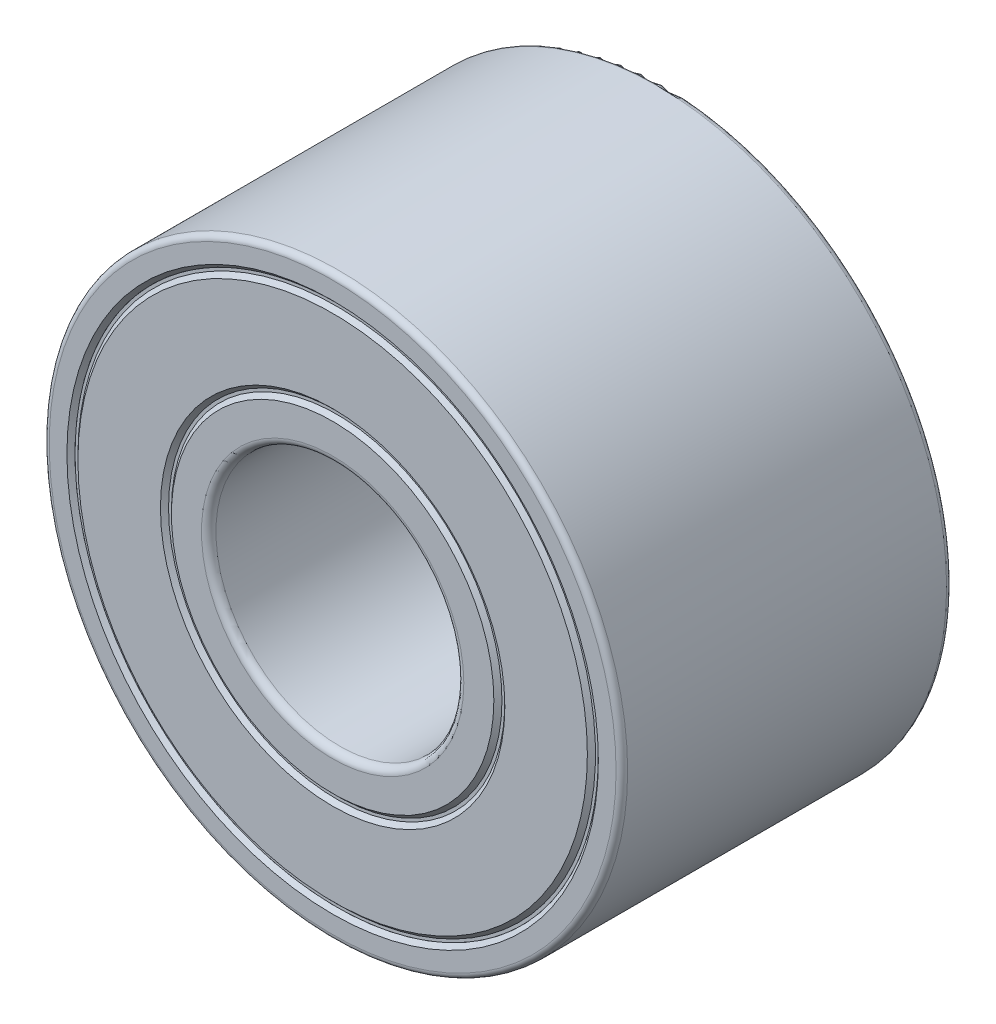
ISO-10303-21;
HEADER;
FILE_DESCRIPTION(('STEP AP214'),'2;1');
FILE_NAME('part.step','',(''),(''),'','','');
FILE_SCHEMA(('AUTOMOTIVE_DESIGN { 1 0 10303 214 1 1 1 1 }'));
ENDSEC;
DATA;
#1=APPLICATION_CONTEXT('core data for automotive mechanical design processes');
#2=APPLICATION_PROTOCOL_DEFINITION('international standard','automotive_design',2000,#1);
#3=PRODUCT_CONTEXT('',#1,'mechanical');
#4=PRODUCT('Part','Part','',(#3));
#5=PRODUCT_RELATED_PRODUCT_CATEGORY('part','',(#4));
#6=PRODUCT_DEFINITION_FORMATION('','',#4);
#7=PRODUCT_DEFINITION_CONTEXT('part definition',#1,'design');
#8=PRODUCT_DEFINITION('design','',#6,#7);
#9=PRODUCT_DEFINITION_SHAPE('','',#8);
#10=(LENGTH_UNIT() NAMED_UNIT(*) SI_UNIT(.MILLI.,.METRE.));
#11=(NAMED_UNIT(*) PLANE_ANGLE_UNIT() SI_UNIT($,.RADIAN.));
#12=(NAMED_UNIT(*) SI_UNIT($,.STERADIAN.) SOLID_ANGLE_UNIT());
#13=UNCERTAINTY_MEASURE_WITH_UNIT(LENGTH_MEASURE(1.E-05),#10,'distance_accuracy_value','');
#14=(GEOMETRIC_REPRESENTATION_CONTEXT(3) GLOBAL_UNCERTAINTY_ASSIGNED_CONTEXT((#13)) GLOBAL_UNIT_ASSIGNED_CONTEXT((#10,
#11,#12)) REPRESENTATION_CONTEXT('',''));
#15=CARTESIAN_POINT('',(0.,0.,0.));
#16=DIRECTION('',(0.,0.,1.));
#17=DIRECTION('',(1.,0.,0.));
#18=AXIS2_PLACEMENT_3D('',#15,#16,#17);
#19=CARTESIAN_POINT('',(0.,0.,-1.951));
#20=DIRECTION('',(0.,0.,-1.));
#21=DIRECTION('',(1.,0.,0.));
#22=AXIS2_PLACEMENT_3D('',#19,#20,#21);
#23=CYLINDRICAL_SURFACE('',#22,2.);
#24=CARTESIAN_POINT('',(0.,0.,-1.951));
#25=DIRECTION('',(0.,0.,-1.));
#26=DIRECTION('',(-1.,0.,0.));
#27=AXIS2_PLACEMENT_3D('',#24,#25,#26);
#28=CIRCLE('',#27,2.);
#29=CARTESIAN_POINT('',(-2.,0.,-1.951));
#30=VERTEX_POINT('',#29);
#31=EDGE_CURVE('E84',#30,#30,#28,.T.);
#32=ORIENTED_EDGE('',*,*,#31,.T.);
#33=EDGE_LOOP('',(#32));
#34=FACE_BOUND('',#33,.T.);
#35=CARTESIAN_POINT('',(0.,0.,-1.824));
#36=DIRECTION('',(0.,0.,-1.));
#37=DIRECTION('',(-1.,0.,0.));
#38=AXIS2_PLACEMENT_3D('',#35,#36,#37);
#39=CIRCLE('',#38,2.);
#40=CARTESIAN_POINT('',(-2.,0.,-1.824));
#41=VERTEX_POINT('',#40);
#42=EDGE_CURVE('E53',#41,#41,#39,.T.);
#43=ORIENTED_EDGE('',*,*,#42,.F.);
#44=EDGE_LOOP('',(#43));
#45=FACE_BOUND('',#44,.T.);
#46=ADVANCED_FACE('F50',(#34,#45),#23,.F.);
#47=CARTESIAN_POINT('',(0.,0.,-1.951));
#48=DIRECTION('',(0.,0.,-1.));
#49=DIRECTION('',(1.,0.,0.));
#50=AXIS2_PLACEMENT_3D('',#47,#48,#49);
#51=CYLINDRICAL_SURFACE('',#50,3.16666666666667);
#52=CARTESIAN_POINT('',(0.,0.,-1.951));
#53=DIRECTION('',(0.,0.,-1.));
#54=DIRECTION('',(-1.,0.,0.));
#55=AXIS2_PLACEMENT_3D('',#52,#53,#54);
#56=CIRCLE('',#55,3.16666666666667);
#57=CARTESIAN_POINT('',(-3.16666666666667,0.,-1.951));
#58=VERTEX_POINT('',#57);
#59=EDGE_CURVE('E11',#58,#58,#56,.T.);
#60=ORIENTED_EDGE('',*,*,#59,.F.);
#61=EDGE_LOOP('',(#60));
#62=FACE_BOUND('',#61,.T.);
#63=CARTESIAN_POINT('',(0.,0.,-1.824));
#64=DIRECTION('',(0.,0.,-1.));
#65=DIRECTION('',(-1.,0.,0.));
#66=AXIS2_PLACEMENT_3D('',#63,#64,#65);
#67=CIRCLE('',#66,3.16666666666667);
#68=CARTESIAN_POINT('',(-3.16666666666667,0.,-1.824));
#69=VERTEX_POINT('',#68);
#70=EDGE_CURVE('E70',#69,#69,#67,.T.);
#71=ORIENTED_EDGE('',*,*,#70,.T.);
#72=EDGE_LOOP('',(#71));
#73=FACE_BOUND('',#72,.T.);
#74=ADVANCED_FACE('F107',(#62,#73),#51,.T.);
#75=CARTESIAN_POINT('',(0.,-3.13166666666667,-1.951));
#76=DIRECTION('',(0.,0.,-1.));
#77=DIRECTION('',(1.,0.,0.));
#78=AXIS2_PLACEMENT_3D('',#75,#76,#77);
#79=PLANE('',#78);
#80=CARTESIAN_POINT('',(0.,0.,-1.951));
#81=DIRECTION('',(0.,0.,-1.));
#82=DIRECTION('',(-1.,0.,0.));
#83=AXIS2_PLACEMENT_3D('',#80,#81,#82);
#84=CIRCLE('',#83,3.13166666666667);
#85=CARTESIAN_POINT('',(-3.13166666666667,0.,-1.951));
#86=VERTEX_POINT('',#85);
#87=EDGE_CURVE('E57',#86,#86,#84,.T.);
#88=ORIENTED_EDGE('',*,*,#87,.F.);
#89=EDGE_LOOP('',(#88));
#90=FACE_BOUND('',#89,.T.);
#91=ORIENTED_EDGE('',*,*,#59,.T.);
#92=EDGE_LOOP('',(#91));
#93=FACE_BOUND('',#92,.T.);
#94=ADVANCED_FACE('F102',(#90,#93),#79,.T.);
#95=CARTESIAN_POINT('',(0.,0.,-1.951));
#96=DIRECTION('',(0.,0.,1.));
#97=DIRECTION('',(-1.,0.,0.));
#98=AXIS2_PLACEMENT_3D('',#95,#96,#97);
#99=CONICAL_SURFACE('',#98,3.13166666666667,0.785398163397448);
#100=CARTESIAN_POINT('',(0.,0.,-2.));
#101=DIRECTION('',(0.,0.,-1.));
#102=DIRECTION('',(-1.,0.,0.));
#103=AXIS2_PLACEMENT_3D('',#100,#101,#102);
#104=CIRCLE('',#103,3.08266666666667);
#105=CARTESIAN_POINT('',(-3.08266666666667,0.,-2.));
#106=VERTEX_POINT('',#105);
#107=EDGE_CURVE('E62',#106,#106,#104,.T.);
#108=ORIENTED_EDGE('',*,*,#107,.F.);
#109=EDGE_LOOP('',(#108));
#110=FACE_BOUND('',#109,.T.);
#111=ORIENTED_EDGE('',*,*,#87,.T.);
#112=EDGE_LOOP('',(#111));
#113=FACE_BOUND('',#112,.T.);
#114=ADVANCED_FACE('F99',(#110,#113),#99,.T.);
#115=CARTESIAN_POINT('',(0.,-2.084,-2.));
#116=DIRECTION('',(0.,0.,-1.));
#117=DIRECTION('',(1.,0.,0.));
#118=AXIS2_PLACEMENT_3D('',#115,#116,#117);
#119=PLANE('',#118);
#120=CARTESIAN_POINT('',(0.,0.,-2.));
#121=DIRECTION('',(0.,0.,-1.));
#122=DIRECTION('',(-1.,0.,0.));
#123=AXIS2_PLACEMENT_3D('',#120,#121,#122);
#124=CIRCLE('',#123,2.084);
#125=CARTESIAN_POINT('',(-2.084,0.,-2.));
#126=VERTEX_POINT('',#125);
#127=EDGE_CURVE('E89',#126,#126,#124,.T.);
#128=ORIENTED_EDGE('',*,*,#127,.F.);
#129=EDGE_LOOP('',(#128));
#130=FACE_BOUND('',#129,.T.);
#131=ORIENTED_EDGE('',*,*,#107,.T.);
#132=EDGE_LOOP('',(#131));
#133=FACE_BOUND('',#132,.T.);
#134=ADVANCED_FACE('F97',(#130,#133),#119,.T.);
#135=CARTESIAN_POINT('',(0.,0.,-2.));
#136=DIRECTION('',(0.,0.,-1.));
#137=DIRECTION('',(1.,0.,0.));
#138=AXIS2_PLACEMENT_3D('',#135,#136,#137);
#139=CONICAL_SURFACE('',#138,2.084,0.785398163397457);
#140=CARTESIAN_POINT('',(0.,0.,-1.951));
#141=DIRECTION('',(0.,0.,-1.));
#142=DIRECTION('',(-1.,0.,0.));
#143=AXIS2_PLACEMENT_3D('',#140,#141,#142);
#144=CIRCLE('',#143,2.035);
#145=CARTESIAN_POINT('',(-2.035,0.,-1.951));
#146=VERTEX_POINT('',#145);
#147=EDGE_CURVE('E80',#146,#146,#144,.T.);
#148=ORIENTED_EDGE('',*,*,#147,.F.);
#149=EDGE_LOOP('',(#148));
#150=FACE_BOUND('',#149,.T.);
#151=ORIENTED_EDGE('',*,*,#127,.T.);
#152=EDGE_LOOP('',(#151));
#153=FACE_BOUND('',#152,.T.);
#154=ADVANCED_FACE('F154',(#150,#153),#139,.F.);
#155=CARTESIAN_POINT('',(0.,-2.035,-1.951));
#156=DIRECTION('',(0.,0.,-1.));
#157=DIRECTION('',(1.,0.,0.));
#158=AXIS2_PLACEMENT_3D('',#155,#156,#157);
#159=PLANE('',#158);
#160=ORIENTED_EDGE('',*,*,#31,.F.);
#161=EDGE_LOOP('',(#160));
#162=FACE_BOUND('',#161,.T.);
#163=ORIENTED_EDGE('',*,*,#147,.T.);
#164=EDGE_LOOP('',(#163));
#165=FACE_BOUND('',#164,.T.);
#166=ADVANCED_FACE('F150',(#162,#165),#159,.T.);
#167=CARTESIAN_POINT('',(0.,-3.13166666666667,-1.824));
#168=DIRECTION('',(0.,0.,-1.));
#169=DIRECTION('',(1.,0.,0.));
#170=AXIS2_PLACEMENT_3D('',#167,#168,#169);
#171=PLANE('',#170);
#172=CARTESIAN_POINT('',(0.,0.,-1.824));
#173=DIRECTION('',(0.,0.,1.));
#174=DIRECTION('',(1.,0.,0.));
#175=AXIS2_PLACEMENT_3D('',#172,#173,#174);
#176=CIRCLE('',#175,3.07906154424528);
#177=CARTESIAN_POINT('',(3.07906154424528,0.,-1.824));
#178=VERTEX_POINT('',#177);
#179=EDGE_CURVE('E67',#178,#178,#176,.F.);
#180=ORIENTED_EDGE('',*,*,#179,.T.);
#181=EDGE_LOOP('',(#180));
#182=FACE_BOUND('',#181,.T.);
#183=ORIENTED_EDGE('',*,*,#70,.F.);
#184=EDGE_LOOP('',(#183));
#185=FACE_BOUND('',#184,.T.);
#186=ADVANCED_FACE('F144',(#182,#185),#171,.F.);
#187=CARTESIAN_POINT('',(0.,0.,-1.86119743878931));
#188=DIRECTION('',(0.,0.,1.));
#189=DIRECTION('',(-1.,0.,0.));
#190=AXIS2_PLACEMENT_3D('',#187,#188,#189);
#191=CONICAL_SURFACE('',#190,3.04186410545597,0.785398163397448);
#192=CARTESIAN_POINT('',(0.,0.,-1.873));
#193=DIRECTION('',(0.,0.,1.));
#194=DIRECTION('',(1.,0.,0.));
#195=AXIS2_PLACEMENT_3D('',#192,#193,#194);
#196=CIRCLE('',#195,3.03006154424528);
#197=CARTESIAN_POINT('',(3.03006154424528,0.,-1.873));
#198=VERTEX_POINT('',#197);
#199=EDGE_CURVE('E71',#198,#198,#196,.F.);
#200=ORIENTED_EDGE('',*,*,#199,.T.);
#201=EDGE_LOOP('',(#200));
#202=FACE_BOUND('',#201,.T.);
#203=ORIENTED_EDGE('',*,*,#179,.F.);
#204=EDGE_LOOP('',(#203));
#205=FACE_BOUND('',#204,.T.);
#206=ADVANCED_FACE('F138',(#202,#205),#191,.F.);
#207=CARTESIAN_POINT('',(0.,-2.084,-1.873));
#208=DIRECTION('',(0.,0.,-1.));
#209=DIRECTION('',(1.,0.,0.));
#210=AXIS2_PLACEMENT_3D('',#207,#208,#209);
#211=PLANE('',#210);
#212=CARTESIAN_POINT('',(0.,0.,-1.873));
#213=DIRECTION('',(0.,0.,1.));
#214=DIRECTION('',(1.,0.,0.));
#215=AXIS2_PLACEMENT_3D('',#212,#213,#214);
#216=CIRCLE('',#215,2.13660512242138);
#217=CARTESIAN_POINT('',(2.13660512242138,0.,-1.873));
#218=VERTEX_POINT('',#217);
#219=EDGE_CURVE('E74',#218,#218,#216,.F.);
#220=ORIENTED_EDGE('',*,*,#219,.T.);
#221=EDGE_LOOP('',(#220));
#222=FACE_BOUND('',#221,.T.);
#223=ORIENTED_EDGE('',*,*,#199,.F.);
#224=EDGE_LOOP('',(#223));
#225=FACE_BOUND('',#224,.T.);
#226=ADVANCED_FACE('F132',(#222,#225),#211,.F.);
#227=CARTESIAN_POINT('',(0.,0.,-1.91019743878931));
#228=DIRECTION('',(0.,0.,-1.));
#229=DIRECTION('',(1.,0.,0.));
#230=AXIS2_PLACEMENT_3D('',#227,#228,#229);
#231=CONICAL_SURFACE('',#230,2.17380256121069,0.785398163397457);
#232=CARTESIAN_POINT('',(0.,0.,-1.824));
#233=DIRECTION('',(0.,0.,1.));
#234=DIRECTION('',(1.,0.,0.));
#235=AXIS2_PLACEMENT_3D('',#232,#233,#234);
#236=CIRCLE('',#235,2.08760512242138);
#237=CARTESIAN_POINT('',(2.08760512242138,0.,-1.824));
#238=VERTEX_POINT('',#237);
#239=EDGE_CURVE('E77',#238,#238,#236,.F.);
#240=ORIENTED_EDGE('',*,*,#239,.T.);
#241=EDGE_LOOP('',(#240));
#242=FACE_BOUND('',#241,.T.);
#243=ORIENTED_EDGE('',*,*,#219,.F.);
#244=EDGE_LOOP('',(#243));
#245=FACE_BOUND('',#244,.T.);
#246=ADVANCED_FACE('F126',(#242,#245),#231,.T.);
#247=CARTESIAN_POINT('',(0.,-2.035,-1.824));
#248=DIRECTION('',(0.,0.,-1.));
#249=DIRECTION('',(1.,0.,0.));
#250=AXIS2_PLACEMENT_3D('',#247,#248,#249);
#251=PLANE('',#250);
#252=ORIENTED_EDGE('',*,*,#42,.T.);
#253=EDGE_LOOP('',(#252));
#254=FACE_BOUND('',#253,.T.);
#255=ORIENTED_EDGE('',*,*,#239,.F.);
#256=EDGE_LOOP('',(#255));
#257=FACE_BOUND('',#256,.T.);
#258=ADVANCED_FACE('F123',(#254,#257),#251,.F.);
#259=CLOSED_SHELL('',(#46,#74,#94,#114,#134,#154,#166,#186,#206,#226,#246,#258));
#260=MANIFOLD_SOLID_BREP('B2',#259);
#261=CARTESIAN_POINT('',(0.,0.,1.951));
#262=DIRECTION('',(0.,0.,1.));
#263=DIRECTION('',(1.,0.,0.));
#264=AXIS2_PLACEMENT_3D('',#261,#262,#263);
#265=CYLINDRICAL_SURFACE('',#264,2.);
#266=CARTESIAN_POINT('',(0.,0.,1.951));
#267=DIRECTION('',(0.,0.,-1.));
#268=DIRECTION('',(-1.,0.,0.));
#269=AXIS2_PLACEMENT_3D('',#266,#267,#268);
#270=CIRCLE('',#269,2.);
#271=CARTESIAN_POINT('',(-2.,0.,1.951));
#272=VERTEX_POINT('',#271);
#273=EDGE_CURVE('E272',#272,#272,#270,.T.);
#274=ORIENTED_EDGE('',*,*,#273,.F.);
#275=EDGE_LOOP('',(#274));
#276=FACE_BOUND('',#275,.T.);
#277=CARTESIAN_POINT('',(0.,0.,1.824));
#278=DIRECTION('',(0.,0.,-1.));
#279=DIRECTION('',(-1.,0.,0.));
#280=AXIS2_PLACEMENT_3D('',#277,#278,#279);
#281=CIRCLE('',#280,2.);
#282=CARTESIAN_POINT('',(-2.,0.,1.824));
#283=VERTEX_POINT('',#282);
#284=EDGE_CURVE('E241',#283,#283,#281,.T.);
#285=ORIENTED_EDGE('',*,*,#284,.T.);
#286=EDGE_LOOP('',(#285));
#287=FACE_BOUND('',#286,.T.);
#288=ADVANCED_FACE('F238',(#276,#287),#265,.F.);
#289=CARTESIAN_POINT('',(0.,0.,1.951));
#290=DIRECTION('',(0.,0.,1.));
#291=DIRECTION('',(1.,0.,0.));
#292=AXIS2_PLACEMENT_3D('',#289,#290,#291);
#293=CYLINDRICAL_SURFACE('',#292,3.16666666666667);
#294=CARTESIAN_POINT('',(0.,0.,1.951));
#295=DIRECTION('',(0.,0.,-1.));
#296=DIRECTION('',(-1.,0.,0.));
#297=AXIS2_PLACEMENT_3D('',#294,#295,#296);
#298=CIRCLE('',#297,3.16666666666667);
#299=CARTESIAN_POINT('',(-3.16666666666667,0.,1.951));
#300=VERTEX_POINT('',#299);
#301=EDGE_CURVE('E49',#300,#300,#298,.T.);
#302=ORIENTED_EDGE('',*,*,#301,.T.);
#303=EDGE_LOOP('',(#302));
#304=FACE_BOUND('',#303,.T.);
#305=CARTESIAN_POINT('',(0.,0.,1.824));
#306=DIRECTION('',(0.,0.,-1.));
#307=DIRECTION('',(-1.,0.,0.));
#308=AXIS2_PLACEMENT_3D('',#305,#306,#307);
#309=CIRCLE('',#308,3.16666666666667);
#310=CARTESIAN_POINT('',(-3.16666666666667,0.,1.824));
#311=VERTEX_POINT('',#310);
#312=EDGE_CURVE('E258',#311,#311,#309,.T.);
#313=ORIENTED_EDGE('',*,*,#312,.F.);
#314=EDGE_LOOP('',(#313));
#315=FACE_BOUND('',#314,.T.);
#316=ADVANCED_FACE('F301',(#304,#315),#293,.T.);
#317=CARTESIAN_POINT('',(0.,-3.13166666666667,1.951));
#318=DIRECTION('',(0.,0.,1.));
#319=DIRECTION('',(1.,0.,0.));
#320=AXIS2_PLACEMENT_3D('',#317,#318,#319);
#321=PLANE('',#320);
#322=CARTESIAN_POINT('',(0.,0.,1.951));
#323=DIRECTION('',(0.,0.,-1.));
#324=DIRECTION('',(-1.,0.,0.));
#325=AXIS2_PLACEMENT_3D('',#322,#323,#324);
#326=CIRCLE('',#325,3.13166666666667);
#327=CARTESIAN_POINT('',(-3.13166666666667,0.,1.951));
#328=VERTEX_POINT('',#327);
#329=EDGE_CURVE('E245',#328,#328,#326,.T.);
#330=ORIENTED_EDGE('',*,*,#329,.T.);
#331=EDGE_LOOP('',(#330));
#332=FACE_BOUND('',#331,.T.);
#333=ORIENTED_EDGE('',*,*,#301,.F.);
#334=EDGE_LOOP('',(#333));
#335=FACE_BOUND('',#334,.T.);
#336=ADVANCED_FACE('F298',(#332,#335),#321,.T.);
#337=CARTESIAN_POINT('',(0.,0.,1.951));
#338=DIRECTION('',(0.,0.,-1.));
#339=DIRECTION('',(-1.,0.,0.));
#340=AXIS2_PLACEMENT_3D('',#337,#338,#339);
#341=CONICAL_SURFACE('',#340,3.13166666666667,0.785398163397448);
#342=CARTESIAN_POINT('',(0.,0.,2.));
#343=DIRECTION('',(0.,0.,-1.));
#344=DIRECTION('',(-1.,0.,0.));
#345=AXIS2_PLACEMENT_3D('',#342,#343,#344);
#346=CIRCLE('',#345,3.08266666666667);
#347=CARTESIAN_POINT('',(-3.08266666666667,0.,2.));
#348=VERTEX_POINT('',#347);
#349=EDGE_CURVE('E250',#348,#348,#346,.T.);
#350=ORIENTED_EDGE('',*,*,#349,.T.);
#351=EDGE_LOOP('',(#350));
#352=FACE_BOUND('',#351,.T.);
#353=ORIENTED_EDGE('',*,*,#329,.F.);
#354=EDGE_LOOP('',(#353));
#355=FACE_BOUND('',#354,.T.);
#356=ADVANCED_FACE('F285',(#352,#355),#341,.T.);
#357=CARTESIAN_POINT('',(0.,-2.084,2.));
#358=DIRECTION('',(0.,0.,1.));
#359=DIRECTION('',(1.,0.,0.));
#360=AXIS2_PLACEMENT_3D('',#357,#358,#359);
#361=PLANE('',#360);
#362=CARTESIAN_POINT('',(0.,0.,2.));
#363=DIRECTION('',(0.,0.,-1.));
#364=DIRECTION('',(-1.,0.,0.));
#365=AXIS2_PLACEMENT_3D('',#362,#363,#364);
#366=CIRCLE('',#365,2.084);
#367=CARTESIAN_POINT('',(-2.084,0.,2.));
#368=VERTEX_POINT('',#367);
#369=EDGE_CURVE('E277',#368,#368,#366,.T.);
#370=ORIENTED_EDGE('',*,*,#369,.T.);
#371=EDGE_LOOP('',(#370));
#372=FACE_BOUND('',#371,.T.);
#373=ORIENTED_EDGE('',*,*,#349,.F.);
#374=EDGE_LOOP('',(#373));
#375=FACE_BOUND('',#374,.T.);
#376=ADVANCED_FACE('F288',(#372,#375),#361,.T.);
#377=CARTESIAN_POINT('',(0.,0.,2.));
#378=DIRECTION('',(0.,0.,1.));
#379=DIRECTION('',(1.,0.,0.));
#380=AXIS2_PLACEMENT_3D('',#377,#378,#379);
#381=CONICAL_SURFACE('',#380,2.084,0.785398163397457);
#382=CARTESIAN_POINT('',(0.,0.,1.951));
#383=DIRECTION('',(0.,0.,-1.));
#384=DIRECTION('',(-1.,0.,0.));
#385=AXIS2_PLACEMENT_3D('',#382,#383,#384);
#386=CIRCLE('',#385,2.035);
#387=CARTESIAN_POINT('',(-2.035,0.,1.951));
#388=VERTEX_POINT('',#387);
#389=EDGE_CURVE('E268',#388,#388,#386,.T.);
#390=ORIENTED_EDGE('',*,*,#389,.T.);
#391=EDGE_LOOP('',(#390));
#392=FACE_BOUND('',#391,.T.);
#393=ORIENTED_EDGE('',*,*,#369,.F.);
#394=EDGE_LOOP('',(#393));
#395=FACE_BOUND('',#394,.T.);
#396=ADVANCED_FACE('F290',(#392,#395),#381,.F.);
#397=CARTESIAN_POINT('',(0.,-2.035,1.951));
#398=DIRECTION('',(0.,0.,1.));
#399=DIRECTION('',(1.,0.,0.));
#400=AXIS2_PLACEMENT_3D('',#397,#398,#399);
#401=PLANE('',#400);
#402=ORIENTED_EDGE('',*,*,#273,.T.);
#403=EDGE_LOOP('',(#402));
#404=FACE_BOUND('',#403,.T.);
#405=ORIENTED_EDGE('',*,*,#389,.F.);
#406=EDGE_LOOP('',(#405));
#407=FACE_BOUND('',#406,.T.);
#408=ADVANCED_FACE('F296',(#404,#407),#401,.T.);
#409=CARTESIAN_POINT('',(0.,-3.13166666666667,1.824));
#410=DIRECTION('',(0.,0.,1.));
#411=DIRECTION('',(1.,0.,0.));
#412=AXIS2_PLACEMENT_3D('',#409,#410,#411);
#413=PLANE('',#412);
#414=CARTESIAN_POINT('',(0.,0.,1.824));
#415=DIRECTION('',(0.,0.,1.));
#416=DIRECTION('',(1.,0.,0.));
#417=AXIS2_PLACEMENT_3D('',#414,#415,#416);
#418=CIRCLE('',#417,3.07906154424528);
#419=CARTESIAN_POINT('',(3.07906154424528,0.,1.824));
#420=VERTEX_POINT('',#419);
#421=EDGE_CURVE('E255',#420,#420,#418,.F.);
#422=ORIENTED_EDGE('',*,*,#421,.F.);
#423=EDGE_LOOP('',(#422));
#424=FACE_BOUND('',#423,.T.);
#425=ORIENTED_EDGE('',*,*,#312,.T.);
#426=EDGE_LOOP('',(#425));
#427=FACE_BOUND('',#426,.T.);
#428=ADVANCED_FACE('F332',(#424,#427),#413,.F.);
#429=CARTESIAN_POINT('',(0.,0.,1.86119743878931));
#430=DIRECTION('',(0.,0.,-1.));
#431=DIRECTION('',(-1.,0.,0.));
#432=AXIS2_PLACEMENT_3D('',#429,#430,#431);
#433=CONICAL_SURFACE('',#432,3.04186410545597,0.785398163397448);
#434=CARTESIAN_POINT('',(0.,0.,1.873));
#435=DIRECTION('',(0.,0.,1.));
#436=DIRECTION('',(1.,0.,0.));
#437=AXIS2_PLACEMENT_3D('',#434,#435,#436);
#438=CIRCLE('',#437,3.03006154424528);
#439=CARTESIAN_POINT('',(3.03006154424528,0.,1.873));
#440=VERTEX_POINT('',#439);
#441=EDGE_CURVE('E259',#440,#440,#438,.F.);
#442=ORIENTED_EDGE('',*,*,#441,.F.);
#443=EDGE_LOOP('',(#442));
#444=FACE_BOUND('',#443,.T.);
#445=ORIENTED_EDGE('',*,*,#421,.T.);
#446=EDGE_LOOP('',(#445));
#447=FACE_BOUND('',#446,.T.);
#448=ADVANCED_FACE('F326',(#444,#447),#433,.F.);
#449=CARTESIAN_POINT('',(0.,-2.084,1.873));
#450=DIRECTION('',(0.,0.,1.));
#451=DIRECTION('',(1.,0.,0.));
#452=AXIS2_PLACEMENT_3D('',#449,#450,#451);
#453=PLANE('',#452);
#454=CARTESIAN_POINT('',(0.,0.,1.873));
#455=DIRECTION('',(0.,0.,1.));
#456=DIRECTION('',(1.,0.,0.));
#457=AXIS2_PLACEMENT_3D('',#454,#455,#456);
#458=CIRCLE('',#457,2.13660512242138);
#459=CARTESIAN_POINT('',(2.13660512242138,0.,1.873));
#460=VERTEX_POINT('',#459);
#461=EDGE_CURVE('E262',#460,#460,#458,.F.);
#462=ORIENTED_EDGE('',*,*,#461,.F.);
#463=EDGE_LOOP('',(#462));
#464=FACE_BOUND('',#463,.T.);
#465=ORIENTED_EDGE('',*,*,#441,.T.);
#466=EDGE_LOOP('',(#465));
#467=FACE_BOUND('',#466,.T.);
#468=ADVANCED_FACE('F320',(#464,#467),#453,.F.);
#469=CARTESIAN_POINT('',(0.,0.,1.91019743878931));
#470=DIRECTION('',(0.,0.,1.));
#471=DIRECTION('',(1.,0.,0.));
#472=AXIS2_PLACEMENT_3D('',#469,#470,#471);
#473=CONICAL_SURFACE('',#472,2.17380256121069,0.785398163397457);
#474=CARTESIAN_POINT('',(0.,0.,1.824));
#475=DIRECTION('',(0.,0.,1.));
#476=DIRECTION('',(1.,0.,0.));
#477=AXIS2_PLACEMENT_3D('',#474,#475,#476);
#478=CIRCLE('',#477,2.08760512242138);
#479=CARTESIAN_POINT('',(2.08760512242138,0.,1.824));
#480=VERTEX_POINT('',#479);
#481=EDGE_CURVE('E265',#480,#480,#478,.F.);
#482=ORIENTED_EDGE('',*,*,#481,.F.);
#483=EDGE_LOOP('',(#482));
#484=FACE_BOUND('',#483,.T.);
#485=ORIENTED_EDGE('',*,*,#461,.T.);
#486=EDGE_LOOP('',(#485));
#487=FACE_BOUND('',#486,.T.);
#488=ADVANCED_FACE('F314',(#484,#487),#473,.T.);
#489=CARTESIAN_POINT('',(0.,-2.035,1.824));
#490=DIRECTION('',(0.,0.,1.));
#491=DIRECTION('',(1.,0.,0.));
#492=AXIS2_PLACEMENT_3D('',#489,#490,#491);
#493=PLANE('',#492);
#494=ORIENTED_EDGE('',*,*,#284,.F.);
#495=EDGE_LOOP('',(#494));
#496=FACE_BOUND('',#495,.T.);
#497=ORIENTED_EDGE('',*,*,#481,.T.);
#498=EDGE_LOOP('',(#497));
#499=FACE_BOUND('',#498,.T.);
#500=ADVANCED_FACE('F311',(#496,#499),#493,.F.);
#501=CLOSED_SHELL('',(#288,#316,#336,#356,#376,#396,#408,#428,#448,#468,#488,#500));
#502=MANIFOLD_SOLID_BREP('B6',#501);
#503=CARTESIAN_POINT('',(2.01973132970906,-1.61068198813509,0.));
#504=DIRECTION('',(-0.781831482468022,0.623489801858743,0.));
#505=DIRECTION('',(0.,0.,-1.));
#506=AXIS2_PLACEMENT_3D('',#503,#504,#505);
#507=SPHERICAL_SURFACE('',#506,0.7);
#508=CARTESIAN_POINT('',(1.47244929198144,-1.17423912683397,0.));
#509=VERTEX_POINT('',#508);
#510=VERTEX_LOOP('',#509);
#511=FACE_BOUND('',#510,.T.);
#512=ADVANCED_FACE('F426',(#511),#507,.T.);
#513=CLOSED_SHELL('',(#512));
#514=MANIFOLD_SOLID_BREP('B44',#513);
#515=CARTESIAN_POINT('',(2.51856377313638,0.574845746053788,0.));
#516=DIRECTION('',(-0.974927912181826,-0.222520933956305,0.));
#517=DIRECTION('',(0.,0.,-1.));
#518=AXIS2_PLACEMENT_3D('',#515,#516,#517);
#519=SPHERICAL_SURFACE('',#518,0.7);
#520=CARTESIAN_POINT('',(1.8361142346091,0.419081092284374,0.));
#521=VERTEX_POINT('',#520);
#522=VERTEX_LOOP('',#521);
#523=FACE_BOUND('',#522,.T.);
#524=ADVANCED_FACE('F445',(#523),#519,.T.);
#525=CLOSED_SHELL('',(#524));
#526=MANIFOLD_SOLID_BREP('B234',#525);
#527=CARTESIAN_POINT('',(1.12086632605371,2.32750290874791,0.));
#528=DIRECTION('',(-0.433883739117565,-0.900968867902416,0.));
#529=DIRECTION('',(0.,0.,-1.));
#530=AXIS2_PLACEMENT_3D('',#527,#528,#529);
#531=SPHERICAL_SURFACE('',#530,0.7);
#532=CARTESIAN_POINT('',(0.817147708671414,1.69682470121622,0.));
#533=VERTEX_POINT('',#532);
#534=VERTEX_LOOP('',#533);
#535=FACE_BOUND('',#534,.T.);
#536=ADVANCED_FACE('F464',(#535),#531,.T.);
#537=CLOSED_SHELL('',(#536));
#538=MANIFOLD_SOLID_BREP('B422',#537);
#539=CARTESIAN_POINT('',(-1.12086632605368,2.32750290874792,0.));
#540=DIRECTION('',(0.433883739117553,-0.900968867902422,0.));
#541=DIRECTION('',(0.,0.,-1.));
#542=AXIS2_PLACEMENT_3D('',#539,#540,#541);
#543=SPHERICAL_SURFACE('',#542,0.7);
#544=CARTESIAN_POINT('',(-0.817147708671391,1.69682470121623,0.));
#545=VERTEX_POINT('',#544);
#546=VERTEX_LOOP('',#545);
#547=FACE_BOUND('',#546,.T.);
#548=ADVANCED_FACE('F483',(#547),#543,.T.);
#549=CLOSED_SHELL('',(#548));
#550=MANIFOLD_SOLID_BREP('B441',#549);
#551=CARTESIAN_POINT('',(-2.51856377313637,0.574845746053822,0.));
#552=DIRECTION('',(0.974927912181823,-0.222520933956318,0.));
#553=DIRECTION('',(0.,0.,-1.));
#554=AXIS2_PLACEMENT_3D('',#551,#552,#553);
#555=SPHERICAL_SURFACE('',#554,0.7);
#556=CARTESIAN_POINT('',(-1.8361142346091,0.419081092284399,0.));
#557=VERTEX_POINT('',#556);
#558=VERTEX_LOOP('',#557);
#559=FACE_BOUND('',#558,.T.);
#560=ADVANCED_FACE('F502',(#559),#555,.T.);
#561=CLOSED_SHELL('',(#560));
#562=MANIFOLD_SOLID_BREP('B460',#561);
#563=CARTESIAN_POINT('',(-2.01973132970908,-1.61068198813506,0.));
#564=DIRECTION('',(0.781831482468031,0.623489801858732,0.));
#565=DIRECTION('',(0.,0.,-1.));
#566=AXIS2_PLACEMENT_3D('',#563,#564,#565);
#567=SPHERICAL_SURFACE('',#566,0.7);
#568=CARTESIAN_POINT('',(-1.47244929198146,-1.17423912683395,0.));
#569=VERTEX_POINT('',#568);
#570=VERTEX_LOOP('',#569);
#571=FACE_BOUND('',#570,.T.);
#572=ADVANCED_FACE('F521',(#571),#567,.T.);
#573=CLOSED_SHELL('',(#572));
#574=MANIFOLD_SOLID_BREP('B479',#573);
#575=CARTESIAN_POINT('',(0.,-2.58333333333333,0.));
#576=DIRECTION('',(0.,1.,0.));
#577=DIRECTION('',(0.,0.,-1.));
#578=AXIS2_PLACEMENT_3D('',#575,#576,#577);
#579=SPHERICAL_SURFACE('',#578,0.7);
#580=CARTESIAN_POINT('',(0.,-1.88333333333333,0.));
#581=VERTEX_POINT('',#580);
#582=VERTEX_LOOP('',#581);
#583=FACE_BOUND('',#582,.T.);
#584=ADVANCED_FACE('F542',(#583),#579,.T.);
#585=CLOSED_SHELL('',(#584));
#586=MANIFOLD_SOLID_BREP('B498',#585);
#587=CARTESIAN_POINT('',(0.,0.,2.));
#588=DIRECTION('',(0.,0.,1.));
#589=DIRECTION('',(1.,0.,0.));
#590=AXIS2_PLACEMENT_3D('',#587,#588,#589);
#591=CYLINDRICAL_SURFACE('',#590,2.);
#592=CARTESIAN_POINT('',(0.,0.,1.951));
#593=DIRECTION('',(0.,0.,1.));
#594=DIRECTION('',(1.,0.,0.));
#595=AXIS2_PLACEMENT_3D('',#592,#593,#594);
#596=CIRCLE('',#595,2.);
#597=CARTESIAN_POINT('',(2.,0.,1.951));
#598=VERTEX_POINT('',#597);
#599=EDGE_CURVE('E541',#598,#598,#596,.F.);
#600=ORIENTED_EDGE('',*,*,#599,.T.);
#601=EDGE_LOOP('',(#600));
#602=FACE_BOUND('',#601,.T.);
#603=CARTESIAN_POINT('',(0.,0.,0.386939558874797));
#604=DIRECTION('',(0.,0.,-1.));
#605=DIRECTION('',(-1.,0.,0.));
#606=AXIS2_PLACEMENT_3D('',#603,#604,#605);
#607=CIRCLE('',#606,2.);
#608=CARTESIAN_POINT('',(-2.,0.,0.386939558874797));
#609=VERTEX_POINT('',#608);
#610=EDGE_CURVE('E594',#609,#609,#607,.T.);
#611=ORIENTED_EDGE('',*,*,#610,.F.);
#612=EDGE_LOOP('',(#611));
#613=FACE_BOUND('',#612,.T.);
#614=ADVANCED_FACE('F562',(#602,#613),#591,.T.);
#615=CARTESIAN_POINT('',(0.,-2.,2.));
#616=DIRECTION('',(0.,0.,1.));
#617=DIRECTION('',(1.,0.,0.));
#618=AXIS2_PLACEMENT_3D('',#615,#616,#617);
#619=PLANE('',#618);
#620=CARTESIAN_POINT('',(0.,0.,2.));
#621=DIRECTION('',(0.,0.,1.));
#622=DIRECTION('',(1.,0.,0.));
#623=AXIS2_PLACEMENT_3D('',#620,#621,#622);
#624=CIRCLE('',#623,1.951);
#625=CARTESIAN_POINT('',(1.951,0.,2.));
#626=VERTEX_POINT('',#625);
#627=EDGE_CURVE('E569',#626,#626,#624,.T.);
#628=ORIENTED_EDGE('',*,*,#627,.T.);
#629=EDGE_LOOP('',(#628));
#630=FACE_BOUND('',#629,.T.);
#631=CARTESIAN_POINT('',(0.,0.,2.));
#632=DIRECTION('',(0.,0.,1.));
#633=DIRECTION('',(1.,0.,0.));
#634=AXIS2_PLACEMENT_3D('',#631,#632,#633);
#635=CIRCLE('',#634,1.5875);
#636=CARTESIAN_POINT('',(1.5875,0.,2.));
#637=VERTEX_POINT('',#636);
#638=EDGE_CURVE('E582',#637,#637,#635,.F.);
#639=ORIENTED_EDGE('',*,*,#638,.T.);
#640=EDGE_LOOP('',(#639));
#641=FACE_BOUND('',#640,.T.);
#642=ADVANCED_FACE('F619',(#630,#641),#619,.T.);
#643=CARTESIAN_POINT('',(0.,0.,2.));
#644=DIRECTION('',(0.,0.,1.));
#645=DIRECTION('',(1.,0.,0.));
#646=AXIS2_PLACEMENT_3D('',#643,#644,#645);
#647=CYLINDRICAL_SURFACE('',#646,1.5);
#648=CARTESIAN_POINT('',(0.,0.,-1.9125));
#649=DIRECTION('',(0.,0.,-1.));
#650=DIRECTION('',(-1.,0.,0.));
#651=AXIS2_PLACEMENT_3D('',#648,#649,#650);
#652=CIRCLE('',#651,1.5);
#653=CARTESIAN_POINT('',(-1.5,0.,-1.9125));
#654=VERTEX_POINT('',#653);
#655=EDGE_CURVE('E585',#654,#654,#652,.T.);
#656=ORIENTED_EDGE('',*,*,#655,.T.);
#657=EDGE_LOOP('',(#656));
#658=FACE_BOUND('',#657,.T.);
#659=CARTESIAN_POINT('',(0.,0.,1.9125));
#660=DIRECTION('',(0.,0.,1.));
#661=DIRECTION('',(1.,0.,0.));
#662=AXIS2_PLACEMENT_3D('',#659,#660,#661);
#663=CIRCLE('',#662,1.5);
#664=CARTESIAN_POINT('',(1.5,0.,1.9125));
#665=VERTEX_POINT('',#664);
#666=EDGE_CURVE('E588',#665,#665,#663,.T.);
#667=ORIENTED_EDGE('',*,*,#666,.T.);
#668=EDGE_LOOP('',(#667));
#669=FACE_BOUND('',#668,.T.);
#670=ADVANCED_FACE('F615',(#658,#669),#647,.F.);
#671=CARTESIAN_POINT('',(0.,-2.,-2.));
#672=DIRECTION('',(0.,0.,-1.));
#673=DIRECTION('',(-1.,0.,0.));
#674=AXIS2_PLACEMENT_3D('',#671,#672,#673);
#675=PLANE('',#674);
#676=CARTESIAN_POINT('',(0.,0.,-2.));
#677=DIRECTION('',(0.,0.,-1.));
#678=DIRECTION('',(-1.,0.,0.));
#679=AXIS2_PLACEMENT_3D('',#676,#677,#678);
#680=CIRCLE('',#679,1.951);
#681=CARTESIAN_POINT('',(-1.951,0.,-2.));
#682=VERTEX_POINT('',#681);
#683=EDGE_CURVE('E573',#682,#682,#680,.T.);
#684=ORIENTED_EDGE('',*,*,#683,.T.);
#685=EDGE_LOOP('',(#684));
#686=FACE_BOUND('',#685,.T.);
#687=CARTESIAN_POINT('',(0.,0.,-2.));
#688=DIRECTION('',(0.,0.,-1.));
#689=DIRECTION('',(-1.,0.,0.));
#690=AXIS2_PLACEMENT_3D('',#687,#688,#689);
#691=CIRCLE('',#690,1.5875);
#692=CARTESIAN_POINT('',(-1.5875,0.,-2.));
#693=VERTEX_POINT('',#692);
#694=EDGE_CURVE('E591',#693,#693,#691,.F.);
#695=ORIENTED_EDGE('',*,*,#694,.T.);
#696=EDGE_LOOP('',(#695));
#697=FACE_BOUND('',#696,.T.);
#698=ADVANCED_FACE('F605',(#686,#697),#675,.T.);
#699=CARTESIAN_POINT('',(0.,0.,-1.951));
#700=DIRECTION('',(0.,0.,-1.));
#701=DIRECTION('',(-1.,0.,0.));
#702=AXIS2_PLACEMENT_3D('',#699,#700,#701);
#703=CIRCLE('',#702,2.);
#704=CARTESIAN_POINT('',(-2.,0.,-1.951));
#705=VERTEX_POINT('',#704);
#706=EDGE_CURVE('E577',#705,#705,#703,.F.);
#707=ORIENTED_EDGE('',*,*,#706,.T.);
#708=EDGE_LOOP('',(#707));
#709=FACE_BOUND('',#708,.T.);
#710=CARTESIAN_POINT('',(0.,0.,-0.386939558874797));
#711=DIRECTION('',(0.,0.,1.));
#712=DIRECTION('',(1.,0.,0.));
#713=AXIS2_PLACEMENT_3D('',#710,#711,#712);
#714=CIRCLE('',#713,2.);
#715=CARTESIAN_POINT('',(2.,0.,-0.386939558874797));
#716=VERTEX_POINT('',#715);
#717=EDGE_CURVE('E597',#716,#716,#714,.T.);
#718=ORIENTED_EDGE('',*,*,#717,.F.);
#719=EDGE_LOOP('',(#718));
#720=FACE_BOUND('',#719,.T.);
#721=ADVANCED_FACE('F603',(#709,#720),#591,.T.);
#722=CARTESIAN_POINT('',(0.,0.,0.));
#723=DIRECTION('',(0.,0.,1.));
#724=DIRECTION('',(1.,0.,0.));
#725=AXIS2_PLACEMENT_3D('',#722,#723,#724);
#726=TOROIDAL_SURFACE('',#725,2.58333333333333,0.7);
#727=ORIENTED_EDGE('',*,*,#610,.T.);
#728=EDGE_LOOP('',(#727));
#729=FACE_BOUND('',#728,.T.);
#730=ORIENTED_EDGE('',*,*,#717,.T.);
#731=EDGE_LOOP('',(#730));
#732=FACE_BOUND('',#731,.T.);
#733=ADVANCED_FACE('F601',(#729,#732),#726,.F.);
#734=CARTESIAN_POINT('',(0.,0.,-1.9125));
#735=DIRECTION('',(0.,0.,-1.));
#736=DIRECTION('',(-1.,0.,0.));
#737=AXIS2_PLACEMENT_3D('',#734,#735,#736);
#738=TOROIDAL_SURFACE('',#737,1.5875,0.0875);
#739=ORIENTED_EDGE('',*,*,#655,.F.);
#740=EDGE_LOOP('',(#739));
#741=FACE_BOUND('',#740,.T.);
#742=ORIENTED_EDGE('',*,*,#694,.F.);
#743=EDGE_LOOP('',(#742));
#744=FACE_BOUND('',#743,.T.);
#745=ADVANCED_FACE('F612',(#741,#744),#738,.T.);
#746=CARTESIAN_POINT('',(0.,0.,1.9125));
#747=DIRECTION('',(0.,0.,1.));
#748=DIRECTION('',(1.,0.,0.));
#749=AXIS2_PLACEMENT_3D('',#746,#747,#748);
#750=TOROIDAL_SURFACE('',#749,1.5875,0.0875);
#751=ORIENTED_EDGE('',*,*,#638,.F.);
#752=EDGE_LOOP('',(#751));
#753=FACE_BOUND('',#752,.T.);
#754=ORIENTED_EDGE('',*,*,#666,.F.);
#755=EDGE_LOOP('',(#754));
#756=FACE_BOUND('',#755,.T.);
#757=ADVANCED_FACE('F635',(#753,#756),#750,.T.);
#758=CARTESIAN_POINT('',(0.,0.,-1.951));
#759=DIRECTION('',(0.,0.,1.));
#760=DIRECTION('',(1.,0.,0.));
#761=AXIS2_PLACEMENT_3D('',#758,#759,#760);
#762=CONICAL_SURFACE('',#761,2.,0.785398163397448);
#763=ORIENTED_EDGE('',*,*,#683,.F.);
#764=EDGE_LOOP('',(#763));
#765=FACE_BOUND('',#764,.T.);
#766=ORIENTED_EDGE('',*,*,#706,.F.);
#767=EDGE_LOOP('',(#766));
#768=FACE_BOUND('',#767,.T.);
#769=ADVANCED_FACE('F638',(#765,#768),#762,.T.);
#770=CARTESIAN_POINT('',(0.,0.,2.));
#771=DIRECTION('',(0.,0.,-1.));
#772=DIRECTION('',(-1.,0.,0.));
#773=AXIS2_PLACEMENT_3D('',#770,#771,#772);
#774=CONICAL_SURFACE('',#773,1.951,0.785398163397453);
#775=ORIENTED_EDGE('',*,*,#599,.F.);
#776=EDGE_LOOP('',(#775));
#777=FACE_BOUND('',#776,.T.);
#778=ORIENTED_EDGE('',*,*,#627,.F.);
#779=EDGE_LOOP('',(#778));
#780=FACE_BOUND('',#779,.T.);
#781=ADVANCED_FACE('F564',(#777,#780),#774,.T.);
#782=CLOSED_SHELL('',(#614,#642,#670,#698,#721,#733,#745,#757,#769,#781));
#783=MANIFOLD_SOLID_BREP('B517',#782);
#784=CARTESIAN_POINT('',(0.,0.,2.));
#785=DIRECTION('',(0.,0.,1.));
#786=DIRECTION('',(1.,0.,0.));
#787=AXIS2_PLACEMENT_3D('',#784,#785,#786);
#788=CYLINDRICAL_SURFACE('',#787,3.16666666666667);
#789=CARTESIAN_POINT('',(0.,0.,1.951));
#790=DIRECTION('',(0.,0.,1.));
#791=DIRECTION('',(1.,0.,0.));
#792=AXIS2_PLACEMENT_3D('',#789,#790,#791);
#793=CIRCLE('',#792,3.16666666666667);
#794=CARTESIAN_POINT('',(3.16666666666667,0.,1.951));
#795=VERTEX_POINT('',#794);
#796=EDGE_CURVE('E721',#795,#795,#793,.T.);
#797=ORIENTED_EDGE('',*,*,#796,.T.);
#798=EDGE_LOOP('',(#797));
#799=FACE_BOUND('',#798,.T.);
#800=CARTESIAN_POINT('',(0.,0.,0.386939558874798));
#801=DIRECTION('',(0.,0.,-1.));
#802=DIRECTION('',(-1.,0.,0.));
#803=AXIS2_PLACEMENT_3D('',#800,#801,#802);
#804=CIRCLE('',#803,3.16666666666667);
#805=CARTESIAN_POINT('',(-3.16666666666667,0.,0.386939558874798));
#806=VERTEX_POINT('',#805);
#807=EDGE_CURVE('E753',#806,#806,#804,.F.);
#808=ORIENTED_EDGE('',*,*,#807,.F.);
#809=EDGE_LOOP('',(#808));
#810=FACE_BOUND('',#809,.T.);
#811=ADVANCED_FACE('F713',(#799,#810),#788,.F.);
#812=CARTESIAN_POINT('',(0.,-3.16666666666667,2.));
#813=DIRECTION('',(0.,0.,1.));
#814=DIRECTION('',(1.,0.,0.));
#815=AXIS2_PLACEMENT_3D('',#812,#813,#814);
#816=PLANE('',#815);
#817=CARTESIAN_POINT('',(0.,0.,2.));
#818=DIRECTION('',(0.,0.,1.));
#819=DIRECTION('',(1.,0.,0.));
#820=AXIS2_PLACEMENT_3D('',#817,#818,#819);
#821=CIRCLE('',#820,3.21566666666667);
#822=CARTESIAN_POINT('',(3.21566666666667,0.,2.));
#823=VERTEX_POINT('',#822);
#824=EDGE_CURVE('E561',#823,#823,#821,.F.);
#825=ORIENTED_EDGE('',*,*,#824,.T.);
#826=EDGE_LOOP('',(#825));
#827=FACE_BOUND('',#826,.T.);
#828=CARTESIAN_POINT('',(0.,0.,2.));
#829=DIRECTION('',(0.,0.,1.));
#830=DIRECTION('',(1.,0.,0.));
#831=AXIS2_PLACEMENT_3D('',#828,#829,#830);
#832=CIRCLE('',#831,3.43);
#833=CARTESIAN_POINT('',(3.43,0.,2.));
#834=VERTEX_POINT('',#833);
#835=EDGE_CURVE('E737',#834,#834,#832,.T.);
#836=ORIENTED_EDGE('',*,*,#835,.T.);
#837=EDGE_LOOP('',(#836));
#838=FACE_BOUND('',#837,.T.);
#839=ADVANCED_FACE('F780',(#827,#838),#816,.T.);
#840=CARTESIAN_POINT('',(0.,0.,2.));
#841=DIRECTION('',(0.,0.,1.));
#842=DIRECTION('',(1.,0.,0.));
#843=AXIS2_PLACEMENT_3D('',#840,#841,#842);
#844=CYLINDRICAL_SURFACE('',#843,3.5);
#845=CARTESIAN_POINT('',(0.,0.,-1.93));
#846=DIRECTION('',(0.,0.,-1.));
#847=DIRECTION('',(-1.,0.,0.));
#848=AXIS2_PLACEMENT_3D('',#845,#846,#847);
#849=CIRCLE('',#848,3.5);
#850=CARTESIAN_POINT('',(-3.5,0.,-1.93));
#851=VERTEX_POINT('',#850);
#852=EDGE_CURVE('E745',#851,#851,#849,.F.);
#853=ORIENTED_EDGE('',*,*,#852,.T.);
#854=EDGE_LOOP('',(#853));
#855=FACE_BOUND('',#854,.T.);
#856=CARTESIAN_POINT('',(0.,0.,1.93));
#857=DIRECTION('',(0.,0.,1.));
#858=DIRECTION('',(1.,0.,0.));
#859=AXIS2_PLACEMENT_3D('',#856,#857,#858);
#860=CIRCLE('',#859,3.5);
#861=CARTESIAN_POINT('',(3.5,0.,1.93));
#862=VERTEX_POINT('',#861);
#863=EDGE_CURVE('E749',#862,#862,#860,.F.);
#864=ORIENTED_EDGE('',*,*,#863,.T.);
#865=EDGE_LOOP('',(#864));
#866=FACE_BOUND('',#865,.T.);
#867=ADVANCED_FACE('F776',(#855,#866),#844,.T.);
#868=CARTESIAN_POINT('',(0.,-3.5,-2.));
#869=DIRECTION('',(0.,0.,-1.));
#870=DIRECTION('',(-1.,0.,0.));
#871=AXIS2_PLACEMENT_3D('',#868,#869,#870);
#872=PLANE('',#871);
#873=CARTESIAN_POINT('',(0.,0.,-2.));
#874=DIRECTION('',(0.,0.,-1.));
#875=DIRECTION('',(-1.,0.,0.));
#876=AXIS2_PLACEMENT_3D('',#873,#874,#875);
#877=CIRCLE('',#876,3.21566666666667);
#878=CARTESIAN_POINT('',(-3.21566666666667,0.,-2.));
#879=VERTEX_POINT('',#878);
#880=EDGE_CURVE('E731',#879,#879,#877,.F.);
#881=ORIENTED_EDGE('',*,*,#880,.T.);
#882=EDGE_LOOP('',(#881));
#883=FACE_BOUND('',#882,.T.);
#884=CARTESIAN_POINT('',(0.,0.,-2.));
#885=DIRECTION('',(0.,0.,-1.));
#886=DIRECTION('',(-1.,0.,0.));
#887=AXIS2_PLACEMENT_3D('',#884,#885,#886);
#888=CIRCLE('',#887,3.43);
#889=CARTESIAN_POINT('',(-3.43,0.,-2.));
#890=VERTEX_POINT('',#889);
#891=EDGE_CURVE('E741',#890,#890,#888,.T.);
#892=ORIENTED_EDGE('',*,*,#891,.T.);
#893=EDGE_LOOP('',(#892));
#894=FACE_BOUND('',#893,.T.);
#895=ADVANCED_FACE('F766',(#883,#894),#872,.T.);
#896=CARTESIAN_POINT('',(0.,0.,-1.951));
#897=DIRECTION('',(0.,0.,-1.));
#898=DIRECTION('',(-1.,0.,0.));
#899=AXIS2_PLACEMENT_3D('',#896,#897,#898);
#900=CIRCLE('',#899,3.16666666666667);
#901=CARTESIAN_POINT('',(-3.16666666666667,0.,-1.951));
#902=VERTEX_POINT('',#901);
#903=EDGE_CURVE('E726',#902,#902,#900,.T.);
#904=ORIENTED_EDGE('',*,*,#903,.T.);
#905=EDGE_LOOP('',(#904));
#906=FACE_BOUND('',#905,.T.);
#907=CARTESIAN_POINT('',(0.,0.,-0.386939558874798));
#908=DIRECTION('',(0.,0.,1.));
#909=DIRECTION('',(1.,0.,0.));
#910=AXIS2_PLACEMENT_3D('',#907,#908,#909);
#911=CIRCLE('',#910,3.16666666666667);
#912=CARTESIAN_POINT('',(3.16666666666667,0.,-0.386939558874798));
#913=VERTEX_POINT('',#912);
#914=EDGE_CURVE('E757',#913,#913,#911,.F.);
#915=ORIENTED_EDGE('',*,*,#914,.F.);
#916=EDGE_LOOP('',(#915));
#917=FACE_BOUND('',#916,.T.);
#918=ADVANCED_FACE('F764',(#906,#917),#788,.F.);
#919=CARTESIAN_POINT('',(0.,0.,0.));
#920=DIRECTION('',(0.,0.,1.));
#921=DIRECTION('',(1.,0.,0.));
#922=AXIS2_PLACEMENT_3D('',#919,#920,#921);
#923=TOROIDAL_SURFACE('',#922,2.58333333333333,0.7);
#924=ORIENTED_EDGE('',*,*,#807,.T.);
#925=EDGE_LOOP('',(#924));
#926=FACE_BOUND('',#925,.T.);
#927=ORIENTED_EDGE('',*,*,#914,.T.);
#928=EDGE_LOOP('',(#927));
#929=FACE_BOUND('',#928,.T.);
#930=ADVANCED_FACE('F762',(#926,#929),#923,.F.);
#931=CARTESIAN_POINT('',(0.,0.,-1.93));
#932=DIRECTION('',(0.,0.,-1.));
#933=DIRECTION('',(-1.,0.,0.));
#934=AXIS2_PLACEMENT_3D('',#931,#932,#933);
#935=TOROIDAL_SURFACE('',#934,3.43,0.07);
#936=ORIENTED_EDGE('',*,*,#891,.F.);
#937=EDGE_LOOP('',(#936));
#938=FACE_BOUND('',#937,.T.);
#939=ORIENTED_EDGE('',*,*,#852,.F.);
#940=EDGE_LOOP('',(#939));
#941=FACE_BOUND('',#940,.T.);
#942=ADVANCED_FACE('F773',(#938,#941),#935,.T.);
#943=CARTESIAN_POINT('',(0.,0.,1.93));
#944=DIRECTION('',(0.,0.,1.));
#945=DIRECTION('',(1.,0.,0.));
#946=AXIS2_PLACEMENT_3D('',#943,#944,#945);
#947=TOROIDAL_SURFACE('',#946,3.43,0.07);
#948=ORIENTED_EDGE('',*,*,#863,.F.);
#949=EDGE_LOOP('',(#948));
#950=FACE_BOUND('',#949,.T.);
#951=ORIENTED_EDGE('',*,*,#835,.F.);
#952=EDGE_LOOP('',(#951));
#953=FACE_BOUND('',#952,.T.);
#954=ADVANCED_FACE('F796',(#950,#953),#947,.T.);
#955=CARTESIAN_POINT('',(0.,0.,-2.));
#956=DIRECTION('',(0.,0.,-1.));
#957=DIRECTION('',(-1.,0.,0.));
#958=AXIS2_PLACEMENT_3D('',#955,#956,#957);
#959=CONICAL_SURFACE('',#958,3.21566666666667,0.785398163397453);
#960=ORIENTED_EDGE('',*,*,#903,.F.);
#961=EDGE_LOOP('',(#960));
#962=FACE_BOUND('',#961,.T.);
#963=ORIENTED_EDGE('',*,*,#880,.F.);
#964=EDGE_LOOP('',(#963));
#965=FACE_BOUND('',#964,.T.);
#966=ADVANCED_FACE('F799',(#962,#965),#959,.F.);
#967=CARTESIAN_POINT('',(0.,0.,1.951));
#968=DIRECTION('',(0.,0.,1.));
#969=DIRECTION('',(1.,0.,0.));
#970=AXIS2_PLACEMENT_3D('',#967,#968,#969);
#971=CONICAL_SURFACE('',#970,3.16666666666667,0.785398163397453);
#972=CARTESIAN_POINT('',(3.21566666666667,0.,2.));
#973=CARTESIAN_POINT('',(3.21515625,0.,1.99948958333333));
#974=CARTESIAN_POINT('',(3.21464583333333,0.,1.99897916666667));
#975=CARTESIAN_POINT('',(3.213625,0.,1.99795833333333));
#976=CARTESIAN_POINT('',(3.21311458333333,0.,1.99744791666667));
#977=CARTESIAN_POINT('',(3.21209375,0.,1.99642708333333));
#978=CARTESIAN_POINT('',(3.21158333333333,0.,1.99591666666667));
#979=CARTESIAN_POINT('',(3.2105625,0.,1.99489583333333));
#980=CARTESIAN_POINT('',(3.21005208333333,0.,1.99438541666667));
#981=CARTESIAN_POINT('',(3.20903125,0.,1.99336458333333));
#982=CARTESIAN_POINT('',(3.20852083333333,0.,1.99285416666667));
#983=CARTESIAN_POINT('',(3.2075,0.,1.99183333333333));
#984=CARTESIAN_POINT('',(3.20698958333333,0.,1.99132291666667));
#985=CARTESIAN_POINT('',(3.20596875,0.,1.99030208333333));
#986=CARTESIAN_POINT('',(3.20545833333333,0.,1.98979166666667));
#987=CARTESIAN_POINT('',(3.2044375,0.,1.98877083333333));
#988=CARTESIAN_POINT('',(3.20392708333333,0.,1.98826041666667));
#989=CARTESIAN_POINT('',(3.20290625,0.,1.98723958333333));
#990=CARTESIAN_POINT('',(3.20239583333333,0.,1.98672916666667));
#991=CARTESIAN_POINT('',(3.201375,0.,1.98570833333333));
#992=CARTESIAN_POINT('',(3.20086458333333,0.,1.98519791666667));
#993=CARTESIAN_POINT('',(3.19984375,0.,1.98417708333333));
#994=CARTESIAN_POINT('',(3.19933333333333,0.,1.98366666666667));
#995=CARTESIAN_POINT('',(3.1983125,0.,1.98264583333333));
#996=CARTESIAN_POINT('',(3.19780208333333,0.,1.98213541666667));
#997=CARTESIAN_POINT('',(3.19678125,0.,1.98111458333333));
#998=CARTESIAN_POINT('',(3.19627083333333,0.,1.98060416666667));
#999=CARTESIAN_POINT('',(3.19525,0.,1.97958333333333));
#1000=CARTESIAN_POINT('',(3.19473958333333,0.,1.97907291666667));
#1001=CARTESIAN_POINT('',(3.19371875,0.,1.97805208333333));
#1002=CARTESIAN_POINT('',(3.19320833333333,0.,1.97754166666667));
#1003=CARTESIAN_POINT('',(3.1921875,0.,1.97652083333333));
#1004=CARTESIAN_POINT('',(3.19167708333333,0.,1.97601041666667));
#1005=CARTESIAN_POINT('',(3.19065625,0.,1.97498958333333));
#1006=CARTESIAN_POINT('',(3.19014583333333,0.,1.97447916666667));
#1007=CARTESIAN_POINT('',(3.189125,0.,1.97345833333333));
#1008=CARTESIAN_POINT('',(3.18861458333333,0.,1.97294791666667));
#1009=CARTESIAN_POINT('',(3.18759375,0.,1.97192708333333));
#1010=CARTESIAN_POINT('',(3.18708333333333,0.,1.97141666666667));
#1011=CARTESIAN_POINT('',(3.1860625,0.,1.97039583333333));
#1012=CARTESIAN_POINT('',(3.18555208333333,0.,1.96988541666667));
#1013=CARTESIAN_POINT('',(3.18453125,0.,1.96886458333333));
#1014=CARTESIAN_POINT('',(3.18402083333333,0.,1.96835416666667));
#1015=CARTESIAN_POINT('',(3.183,0.,1.96733333333333));
#1016=CARTESIAN_POINT('',(3.18248958333333,0.,1.96682291666667));
#1017=CARTESIAN_POINT('',(3.18146875,0.,1.96580208333333));
#1018=CARTESIAN_POINT('',(3.18095833333333,0.,1.96529166666667));
#1019=CARTESIAN_POINT('',(3.1799375,0.,1.96427083333333));
#1020=CARTESIAN_POINT('',(3.17942708333333,0.,1.96376041666667));
#1021=CARTESIAN_POINT('',(3.17840625,0.,1.96273958333333));
#1022=CARTESIAN_POINT('',(3.17789583333333,0.,1.96222916666667));
#1023=CARTESIAN_POINT('',(3.176875,0.,1.96120833333333));
#1024=CARTESIAN_POINT('',(3.17636458333333,0.,1.96069791666667));
#1025=CARTESIAN_POINT('',(3.17534375,0.,1.95967708333333));
#1026=CARTESIAN_POINT('',(3.17483333333333,0.,1.95916666666667));
#1027=CARTESIAN_POINT('',(3.1738125,0.,1.95814583333333));
#1028=CARTESIAN_POINT('',(3.17330208333333,0.,1.95763541666667));
#1029=CARTESIAN_POINT('',(3.17228125,0.,1.95661458333333));
#1030=CARTESIAN_POINT('',(3.17177083333333,0.,1.95610416666667));
#1031=CARTESIAN_POINT('',(3.17075,0.,1.95508333333333));
#1032=CARTESIAN_POINT('',(3.17023958333333,0.,1.95457291666667));
#1033=CARTESIAN_POINT('',(3.16921875,0.,1.95355208333333));
#1034=CARTESIAN_POINT('',(3.16870833333333,0.,1.95304166666667));
#1035=CARTESIAN_POINT('',(3.1676875,0.,1.95202083333333));
#1036=CARTESIAN_POINT('',(3.16717708333333,0.,1.95151041666667));
#1037=CARTESIAN_POINT('',(3.16666666666667,0.,1.951));
#1038=B_SPLINE_CURVE_WITH_KNOTS('',3,(#972,#973,#974,#975,#976,#977,#978,#979,#980,#981,#982,
#983,#984,#985,#986,#987,#988,#989,#990,#991,#992,#993,#994,#995,#996,#997,#998,#999,#1000,
#1001,#1002,#1003,#1004,#1005,#1006,#1007,#1008,#1009,#1010,#1011,#1012,#1013,#1014,#1015,#1016,
#1017,#1018,#1019,#1020,#1021,#1022,#1023,#1024,#1025,#1026,#1027,#1028,#1029,#1030,#1031,#1032,
#1033,#1034,#1035,#1036,#1037),.UNSPECIFIED.,.F.,.F.,(4,2,2,2,2,2,2,2,2,2,2,2,2,2,2,2,2,2,2,2,2,
2,2,2,2,2,2,2,2,2,2,2,4),(0.,0.00216551451738382,0.00433102903476795,0.00649654355215146,
0.00866205806953559,0.0108275725869191,0.0129930871043032,0.0151586016216867,0.0173241161390709,
0.0194896306564547,0.0216551451738385,0.0238206596912223,0.0259861742086062,0.02815168872599,
0.0303172032433738,0.0324827177607576,0.0346482322781414,0.0368137467955253,0.0389792613129091,
0.0411447758302929,0.043310290347677,0.0454758048650609,0.0476413193824447,0.0498068338998285,
0.0519723484172123,0.0541378629345961,0.05630337745198,0.0584688919693638,0.0606344064867476,
0.0627999210041317,0.0649654355215152,0.0671309500388992,0.0692964645562829),.UNSPECIFIED.);
#1039=EDGE_CURVE('BSEAM715',#823,#795,#1038,.T.);
#1040=ORIENTED_EDGE('',*,*,#824,.F.);
#1041=ORIENTED_EDGE('',*,*,#796,.F.);
#1042=ORIENTED_EDGE('',*,*,#1039,.T.);
#1043=ORIENTED_EDGE('',*,*,#1039,.F.);
#1044=EDGE_LOOP('',(#1040,#1042,#1041,#1043));
#1045=FACE_BOUND('',#1044,.T.);
#1046=ADVANCED_FACE('F715',(#1045),#971,.F.);
#1047=CLOSED_SHELL('',(#811,#839,#867,#895,#918,#930,#942,#954,#966,#1046));
#1048=MANIFOLD_SOLID_BREP('B536',#1047);
#1049=ADVANCED_BREP_SHAPE_REPRESENTATION('',(#18,#260,#502,#514,#526,#538,#550,#562,#574,#586,
#783,#1048),#14);
#1050=SHAPE_DEFINITION_REPRESENTATION(#9,#1049);
ENDSEC;
END-ISO-10303-21;
